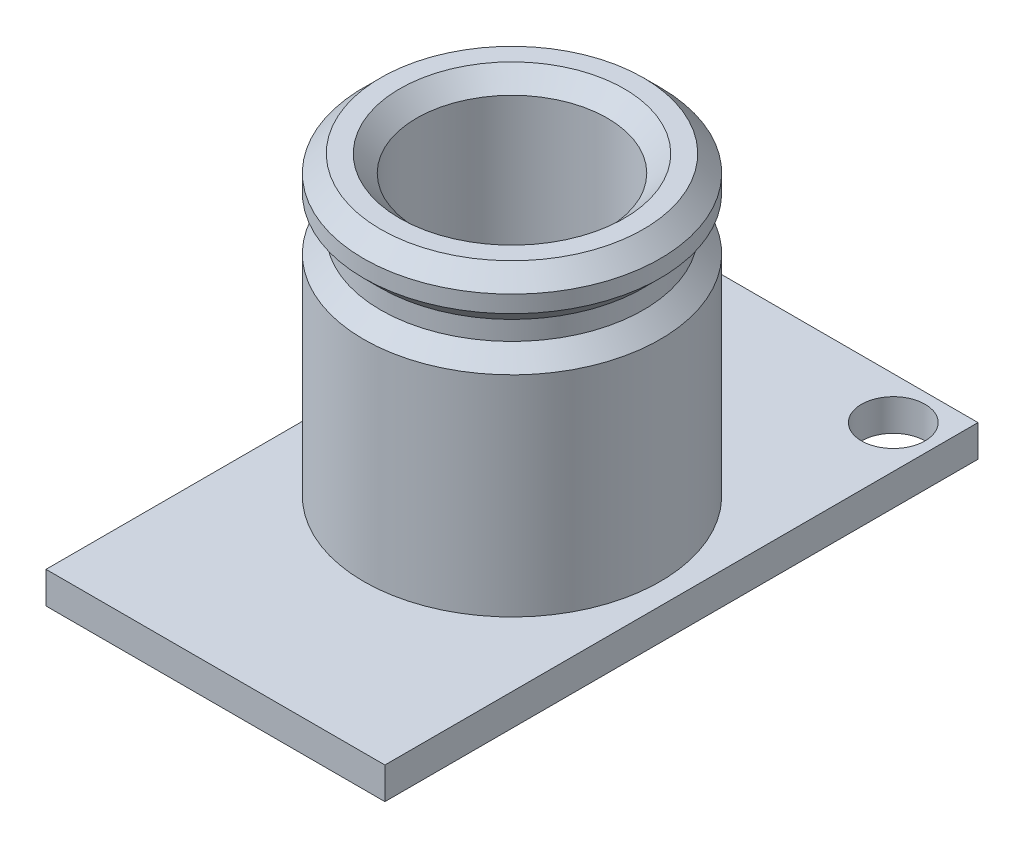
ISO-10303-21;
HEADER;
FILE_DESCRIPTION(('STEP AP214'),'2;1');
FILE_NAME('part.step','',(''),(''),'','','');
FILE_SCHEMA(('AUTOMOTIVE_DESIGN { 1 0 10303 214 1 1 1 1 }'));
ENDSEC;
DATA;
#1=APPLICATION_CONTEXT('core data for automotive mechanical design processes');
#2=APPLICATION_PROTOCOL_DEFINITION('international standard','automotive_design',2000,#1);
#3=PRODUCT_CONTEXT('',#1,'mechanical');
#4=PRODUCT('Part','Part','',(#3));
#5=PRODUCT_RELATED_PRODUCT_CATEGORY('part','',(#4));
#6=PRODUCT_DEFINITION_FORMATION('','',#4);
#7=PRODUCT_DEFINITION_CONTEXT('part definition',#1,'design');
#8=PRODUCT_DEFINITION('design','',#6,#7);
#9=PRODUCT_DEFINITION_SHAPE('','',#8);
#10=(LENGTH_UNIT() NAMED_UNIT(*) SI_UNIT(.MILLI.,.METRE.));
#11=(NAMED_UNIT(*) PLANE_ANGLE_UNIT() SI_UNIT($,.RADIAN.));
#12=(NAMED_UNIT(*) SI_UNIT($,.STERADIAN.) SOLID_ANGLE_UNIT());
#13=UNCERTAINTY_MEASURE_WITH_UNIT(LENGTH_MEASURE(1.E-05),#10,'distance_accuracy_value','');
#14=(GEOMETRIC_REPRESENTATION_CONTEXT(3) GLOBAL_UNCERTAINTY_ASSIGNED_CONTEXT((#13)) GLOBAL_UNIT_ASSIGNED_CONTEXT((#10,
#11,#12)) REPRESENTATION_CONTEXT('',''));
#15=CARTESIAN_POINT('',(0.,0.,0.));
#16=DIRECTION('',(0.,0.,1.));
#17=DIRECTION('',(1.,0.,0.));
#18=AXIS2_PLACEMENT_3D('',#15,#16,#17);
#19=CARTESIAN_POINT('',(0.,15.5,0.));
#20=DIRECTION('',(0.,-1.,0.));
#21=DIRECTION('',(0.,0.,-1.));
#22=AXIS2_PLACEMENT_3D('',#19,#20,#21);
#23=CYLINDRICAL_SURFACE('',#22,7.);
#24=CARTESIAN_POINT('',(0.,13.9,0.));
#25=DIRECTION('',(0.,-1.,0.));
#26=DIRECTION('',(0.,0.,-1.));
#27=AXIS2_PLACEMENT_3D('',#24,#25,#26);
#28=CIRCLE('',#27,7.00000000000005);
#29=CARTESIAN_POINT('',(0.,13.9,-7.));
#30=VERTEX_POINT('',#29);
#31=EDGE_CURVE('E74',#30,#30,#28,.T.);
#32=ORIENTED_EDGE('',*,*,#31,.F.);
#33=EDGE_LOOP('',(#32));
#34=FACE_BOUND('',#33,.T.);
#35=CARTESIAN_POINT('',(0.,14.7,0.));
#36=DIRECTION('',(0.,1.,0.));
#37=DIRECTION('',(0.,0.,1.));
#38=AXIS2_PLACEMENT_3D('',#35,#36,#37);
#39=CIRCLE('',#38,7.);
#40=CARTESIAN_POINT('',(0.,14.7,7.));
#41=VERTEX_POINT('',#40);
#42=EDGE_CURVE('E62',#41,#41,#39,.F.);
#43=ORIENTED_EDGE('',*,*,#42,.T.);
#44=EDGE_LOOP('',(#43));
#45=FACE_BOUND('',#44,.T.);
#46=ADVANCED_FACE('F50',(#34,#45),#23,.T.);
#47=CARTESIAN_POINT('',(0.,15.5,0.));
#48=DIRECTION('',(0.,1.,0.));
#49=DIRECTION('',(0.,0.,1.));
#50=AXIS2_PLACEMENT_3D('',#47,#48,#49);
#51=PLANE('',#50);
#52=CARTESIAN_POINT('',(0.,15.5,0.));
#53=DIRECTION('',(0.,1.,0.));
#54=DIRECTION('',(0.,0.,1.));
#55=AXIS2_PLACEMENT_3D('',#52,#53,#54);
#56=CIRCLE('',#55,5.3);
#57=CARTESIAN_POINT('',(0.,15.5,5.3));
#58=VERTEX_POINT('',#57);
#59=EDGE_CURVE('E11',#58,#58,#56,.F.);
#60=ORIENTED_EDGE('',*,*,#59,.T.);
#61=EDGE_LOOP('',(#60));
#62=FACE_BOUND('',#61,.T.);
#63=CARTESIAN_POINT('',(0.,15.5,0.));
#64=DIRECTION('',(0.,1.,0.));
#65=DIRECTION('',(0.,0.,1.));
#66=AXIS2_PLACEMENT_3D('',#63,#64,#65);
#67=CIRCLE('',#66,6.19999999999999);
#68=CARTESIAN_POINT('',(0.,15.5,6.19999999999999));
#69=VERTEX_POINT('',#68);
#70=EDGE_CURVE('E66',#69,#69,#67,.T.);
#71=ORIENTED_EDGE('',*,*,#70,.T.);
#72=EDGE_LOOP('',(#71));
#73=FACE_BOUND('',#72,.T.);
#74=ADVANCED_FACE('F108',(#62,#73),#51,.T.);
#75=CARTESIAN_POINT('',(0.,15.5,0.));
#76=DIRECTION('',(0.,-1.,0.));
#77=DIRECTION('',(0.,0.,-1.));
#78=AXIS2_PLACEMENT_3D('',#75,#76,#77);
#79=CONICAL_SURFACE('',#78,6.19999999999999,0.785398163397447);
#80=ORIENTED_EDGE('',*,*,#42,.F.);
#81=EDGE_LOOP('',(#80));
#82=FACE_BOUND('',#81,.T.);
#83=ORIENTED_EDGE('',*,*,#70,.F.);
#84=EDGE_LOOP('',(#83));
#85=FACE_BOUND('',#84,.T.);
#86=ADVANCED_FACE('F114',(#82,#85),#79,.T.);
#87=CARTESIAN_POINT('',(0.,13.9,0.));
#88=DIRECTION('',(0.,1.,0.));
#89=DIRECTION('',(0.,0.,1.));
#90=AXIS2_PLACEMENT_3D('',#87,#88,#89);
#91=CONICAL_SURFACE('',#90,7.00000000000005,0.785398163397366);
#92=CARTESIAN_POINT('',(0.,13.0999999999999,0.));
#93=DIRECTION('',(0.,-1.,0.));
#94=DIRECTION('',(0.,0.,-1.));
#95=AXIS2_PLACEMENT_3D('',#92,#93,#94);
#96=CIRCLE('',#95,6.20000000000004);
#97=CARTESIAN_POINT('',(0.,13.0999999999999,-6.2));
#98=VERTEX_POINT('',#97);
#99=EDGE_CURVE('E77',#98,#98,#96,.T.);
#100=ORIENTED_EDGE('',*,*,#99,.F.);
#101=EDGE_LOOP('',(#100));
#102=FACE_BOUND('',#101,.T.);
#103=ORIENTED_EDGE('',*,*,#31,.T.);
#104=EDGE_LOOP('',(#103));
#105=FACE_BOUND('',#104,.T.);
#106=ADVANCED_FACE('F122',(#102,#105),#91,.T.);
#107=CARTESIAN_POINT('',(0.,-1000.,-3.43024899888577E-12));
#108=DIRECTION('',(0.,-1.,0.));
#109=DIRECTION('',(0.,0.,-1.));
#110=AXIS2_PLACEMENT_3D('',#107,#108,#109);
#111=CYLINDRICAL_SURFACE('',#110,6.20000000000004);
#112=CARTESIAN_POINT('',(0.,12.2,0.));
#113=DIRECTION('',(0.,-1.,0.));
#114=DIRECTION('',(0.,0.,-1.));
#115=AXIS2_PLACEMENT_3D('',#112,#113,#114);
#116=CIRCLE('',#115,6.20000000000004);
#117=CARTESIAN_POINT('',(0.,12.2,-6.2));
#118=VERTEX_POINT('',#117);
#119=EDGE_CURVE('E80',#118,#118,#116,.T.);
#120=ORIENTED_EDGE('',*,*,#119,.F.);
#121=EDGE_LOOP('',(#120));
#122=FACE_BOUND('',#121,.T.);
#123=ORIENTED_EDGE('',*,*,#99,.T.);
#124=EDGE_LOOP('',(#123));
#125=FACE_BOUND('',#124,.T.);
#126=ADVANCED_FACE('F127',(#122,#125),#111,.T.);
#127=CARTESIAN_POINT('',(0.,12.2,0.));
#128=DIRECTION('',(0.,-1.,0.));
#129=DIRECTION('',(0.,0.,-1.));
#130=AXIS2_PLACEMENT_3D('',#127,#128,#129);
#131=CONICAL_SURFACE('',#130,6.20000000000004,0.785398163397503);
#132=CARTESIAN_POINT('',(0.,11.4000000000001,0.));
#133=DIRECTION('',(0.,-1.,0.));
#134=DIRECTION('',(0.,0.,-1.));
#135=AXIS2_PLACEMENT_3D('',#132,#133,#134);
#136=CIRCLE('',#135,7.00000000000004);
#137=CARTESIAN_POINT('',(0.,11.4000000000001,-7.));
#138=VERTEX_POINT('',#137);
#139=EDGE_CURVE('E83',#138,#138,#136,.T.);
#140=ORIENTED_EDGE('',*,*,#139,.F.);
#141=EDGE_LOOP('',(#140));
#142=FACE_BOUND('',#141,.T.);
#143=ORIENTED_EDGE('',*,*,#119,.T.);
#144=EDGE_LOOP('',(#143));
#145=FACE_BOUND('',#144,.T.);
#146=ADVANCED_FACE('F137',(#142,#145),#131,.T.);
#147=CARTESIAN_POINT('',(0.,1.5,0.));
#148=DIRECTION('',(0.,1.,0.));
#149=DIRECTION('',(0.,0.,1.));
#150=AXIS2_PLACEMENT_3D('',#147,#148,#149);
#151=PLANE('',#150);
#152=CARTESIAN_POINT('',(0.,1.5,0.));
#153=DIRECTION('',(0.,1.,0.));
#154=DIRECTION('',(0.,0.,1.));
#155=AXIS2_PLACEMENT_3D('',#152,#153,#154);
#156=CIRCLE('',#155,7.);
#157=CARTESIAN_POINT('',(0.,1.5,7.));
#158=VERTEX_POINT('',#157);
#159=EDGE_CURVE('E71',#158,#158,#156,.T.);
#160=ORIENTED_EDGE('',*,*,#159,.F.);
#161=EDGE_LOOP('',(#160));
#162=FACE_BOUND('',#161,.T.);
#163=ADVANCED_FACE('F103',(#162),#151,.F.);
#164=ORIENTED_EDGE('',*,*,#139,.T.);
#165=EDGE_LOOP('',(#164));
#166=FACE_BOUND('',#165,.T.);
#167=ORIENTED_EDGE('',*,*,#159,.T.);
#168=EDGE_LOOP('',(#167));
#169=FACE_BOUND('',#168,.T.);
#170=ADVANCED_FACE('F94',(#166,#169),#23,.T.);
#171=CARTESIAN_POINT('',(0.,7.5,0.));
#172=DIRECTION('',(0.,1.,0.));
#173=DIRECTION('',(0.,0.,1.));
#174=AXIS2_PLACEMENT_3D('',#171,#172,#173);
#175=CYLINDRICAL_SURFACE('',#174,4.5);
#176=CARTESIAN_POINT('',(0.,14.7,0.));
#177=DIRECTION('',(0.,1.,0.));
#178=DIRECTION('',(0.,0.,1.));
#179=AXIS2_PLACEMENT_3D('',#176,#177,#178);
#180=CIRCLE('',#179,4.5);
#181=CARTESIAN_POINT('',(0.,14.7,4.5));
#182=VERTEX_POINT('',#181);
#183=EDGE_CURVE('E58',#182,#182,#180,.T.);
#184=ORIENTED_EDGE('',*,*,#183,.T.);
#185=EDGE_LOOP('',(#184));
#186=FACE_BOUND('',#185,.T.);
#187=CARTESIAN_POINT('',(0.,7.5,0.));
#188=DIRECTION('',(0.,1.,0.));
#189=DIRECTION('',(0.,0.,1.));
#190=AXIS2_PLACEMENT_3D('',#187,#188,#189);
#191=CIRCLE('',#190,4.5);
#192=CARTESIAN_POINT('',(0.,7.5,4.5));
#193=VERTEX_POINT('',#192);
#194=EDGE_CURVE('E86',#193,#193,#191,.T.);
#195=ORIENTED_EDGE('',*,*,#194,.F.);
#196=EDGE_LOOP('',(#195));
#197=FACE_BOUND('',#196,.T.);
#198=ADVANCED_FACE('F92',(#186,#197),#175,.F.);
#199=CARTESIAN_POINT('',(0.,7.5,0.));
#200=DIRECTION('',(0.,1.,0.));
#201=DIRECTION('',(0.,0.,1.));
#202=AXIS2_PLACEMENT_3D('',#199,#200,#201);
#203=PLANE('',#202);
#204=ORIENTED_EDGE('',*,*,#194,.T.);
#205=EDGE_LOOP('',(#204));
#206=FACE_BOUND('',#205,.T.);
#207=ADVANCED_FACE('F90',(#206),#203,.T.);
#208=CARTESIAN_POINT('',(0.,14.7,0.));
#209=DIRECTION('',(0.,1.,0.));
#210=DIRECTION('',(0.,0.,1.));
#211=AXIS2_PLACEMENT_3D('',#208,#209,#210);
#212=CONICAL_SURFACE('',#211,4.5,0.785398163397449);
#213=ORIENTED_EDGE('',*,*,#59,.F.);
#214=EDGE_LOOP('',(#213));
#215=FACE_BOUND('',#214,.T.);
#216=ORIENTED_EDGE('',*,*,#183,.F.);
#217=EDGE_LOOP('',(#216));
#218=FACE_BOUND('',#217,.T.);
#219=ADVANCED_FACE('F53',(#215,#218),#212,.F.);
#220=CLOSED_SHELL('',(#46,#74,#86,#106,#126,#146,#163,#170,#198,#207,#219));
#221=MANIFOLD_SOLID_BREP('B2',#220);
#222=CARTESIAN_POINT('',(8.,1.5,-14.));
#223=DIRECTION('',(-1.,0.,0.));
#224=DIRECTION('',(0.,0.,1.));
#225=AXIS2_PLACEMENT_3D('',#222,#223,#224);
#226=PLANE('',#225);
#227=DIRECTION('',(0.,0.,-1.));
#228=VECTOR('',#227,1.);
#229=CARTESIAN_POINT('',(8.,0.,-14.));
#230=LINE('',#229,#228);
#231=CARTESIAN_POINT('',(8.,0.,14.));
#232=VERTEX_POINT('',#231);
#233=CARTESIAN_POINT('',(8.,0.,-14.));
#234=VERTEX_POINT('',#233);
#235=EDGE_CURVE('E278',#232,#234,#230,.T.);
#236=ORIENTED_EDGE('',*,*,#235,.T.);
#237=DIRECTION('',(0.,-1.,0.));
#238=VECTOR('',#237,1.);
#239=CARTESIAN_POINT('',(8.,1.5,-14.));
#240=LINE('',#239,#238);
#241=CARTESIAN_POINT('',(8.,1.5,-14.));
#242=VERTEX_POINT('',#241);
#243=EDGE_CURVE('E48',#242,#234,#240,.T.);
#244=ORIENTED_EDGE('',*,*,#243,.F.);
#245=DIRECTION('',(0.,0.,-1.));
#246=VECTOR('',#245,1.);
#247=CARTESIAN_POINT('',(8.,1.5,-14.));
#248=LINE('',#247,#246);
#249=CARTESIAN_POINT('',(8.,1.5,14.));
#250=VERTEX_POINT('',#249);
#251=EDGE_CURVE('E266',#250,#242,#248,.T.);
#252=ORIENTED_EDGE('',*,*,#251,.F.);
#253=DIRECTION('',(0.,-1.,0.));
#254=VECTOR('',#253,1.);
#255=CARTESIAN_POINT('',(8.,1.5,14.));
#256=LINE('',#255,#254);
#257=EDGE_CURVE('E274',#250,#232,#256,.T.);
#258=ORIENTED_EDGE('',*,*,#257,.T.);
#259=EDGE_LOOP('',(#236,#244,#252,#258));
#260=FACE_BOUND('',#259,.T.);
#261=ADVANCED_FACE('F215',(#260),#226,.F.);
#262=CARTESIAN_POINT('',(-8.,1.5,-14.));
#263=DIRECTION('',(0.,0.,1.));
#264=DIRECTION('',(1.,0.,0.));
#265=AXIS2_PLACEMENT_3D('',#262,#263,#264);
#266=PLANE('',#265);
#267=DIRECTION('',(-1.,0.,0.));
#268=VECTOR('',#267,1.);
#269=CARTESIAN_POINT('',(-8.,0.,-14.));
#270=LINE('',#269,#268);
#271=CARTESIAN_POINT('',(-8.,0.,-14.));
#272=VERTEX_POINT('',#271);
#273=EDGE_CURVE('E270',#234,#272,#270,.T.);
#274=ORIENTED_EDGE('',*,*,#273,.T.);
#275=DIRECTION('',(0.,-1.,0.));
#276=VECTOR('',#275,1.);
#277=CARTESIAN_POINT('',(-8.,1.5,-14.));
#278=LINE('',#277,#276);
#279=CARTESIAN_POINT('',(-8.,1.5,-14.));
#280=VERTEX_POINT('',#279);
#281=EDGE_CURVE('E223',#280,#272,#278,.T.);
#282=ORIENTED_EDGE('',*,*,#281,.F.);
#283=DIRECTION('',(-1.,0.,0.));
#284=VECTOR('',#283,1.);
#285=CARTESIAN_POINT('',(-8.,1.5,-14.));
#286=LINE('',#285,#284);
#287=EDGE_CURVE('E261',#242,#280,#286,.T.);
#288=ORIENTED_EDGE('',*,*,#287,.F.);
#289=ORIENTED_EDGE('',*,*,#243,.T.);
#290=EDGE_LOOP('',(#274,#282,#288,#289));
#291=FACE_BOUND('',#290,.T.);
#292=ADVANCED_FACE('F269',(#291),#266,.F.);
#293=CARTESIAN_POINT('',(-8.,1.5,-14.));
#294=DIRECTION('',(1.,0.,0.));
#295=DIRECTION('',(0.,0.,-1.));
#296=AXIS2_PLACEMENT_3D('',#293,#294,#295);
#297=PLANE('',#296);
#298=DIRECTION('',(0.,0.,1.));
#299=VECTOR('',#298,1.);
#300=CARTESIAN_POINT('',(-8.,0.,-14.));
#301=LINE('',#300,#299);
#302=CARTESIAN_POINT('',(-8.,0.,14.));
#303=VERTEX_POINT('',#302);
#304=EDGE_CURVE('E248',#272,#303,#301,.T.);
#305=ORIENTED_EDGE('',*,*,#304,.T.);
#306=DIRECTION('',(0.,-1.,0.));
#307=VECTOR('',#306,1.);
#308=CARTESIAN_POINT('',(-8.,1.5,14.));
#309=LINE('',#308,#307);
#310=CARTESIAN_POINT('',(-8.,1.5,14.));
#311=VERTEX_POINT('',#310);
#312=EDGE_CURVE('E271',#311,#303,#309,.T.);
#313=ORIENTED_EDGE('',*,*,#312,.F.);
#314=DIRECTION('',(0.,0.,1.));
#315=VECTOR('',#314,1.);
#316=CARTESIAN_POINT('',(-8.,1.5,-14.));
#317=LINE('',#316,#315);
#318=EDGE_CURVE('E264',#280,#311,#317,.T.);
#319=ORIENTED_EDGE('',*,*,#318,.F.);
#320=ORIENTED_EDGE('',*,*,#281,.T.);
#321=EDGE_LOOP('',(#305,#313,#319,#320));
#322=FACE_BOUND('',#321,.T.);
#323=ADVANCED_FACE('F272',(#322),#297,.F.);
#324=CARTESIAN_POINT('',(-8.,1.5,14.));
#325=DIRECTION('',(0.,0.,-1.));
#326=DIRECTION('',(-1.,0.,0.));
#327=AXIS2_PLACEMENT_3D('',#324,#325,#326);
#328=PLANE('',#327);
#329=DIRECTION('',(1.,0.,0.));
#330=VECTOR('',#329,1.);
#331=CARTESIAN_POINT('',(-8.,0.,14.));
#332=LINE('',#331,#330);
#333=EDGE_CURVE('E254',#303,#232,#332,.T.);
#334=ORIENTED_EDGE('',*,*,#333,.T.);
#335=ORIENTED_EDGE('',*,*,#257,.F.);
#336=DIRECTION('',(1.,0.,0.));
#337=VECTOR('',#336,1.);
#338=CARTESIAN_POINT('',(-8.,1.5,14.));
#339=LINE('',#338,#337);
#340=EDGE_CURVE('E231',#311,#250,#339,.T.);
#341=ORIENTED_EDGE('',*,*,#340,.F.);
#342=ORIENTED_EDGE('',*,*,#312,.T.);
#343=EDGE_LOOP('',(#334,#335,#341,#342));
#344=FACE_BOUND('',#343,.T.);
#345=ADVANCED_FACE('F286',(#344),#328,.F.);
#346=CARTESIAN_POINT('',(0.,1.5,0.));
#347=DIRECTION('',(0.,1.,0.));
#348=DIRECTION('',(0.,0.,1.));
#349=AXIS2_PLACEMENT_3D('',#346,#347,#348);
#350=PLANE('',#349);
#351=CARTESIAN_POINT('',(6.,1.5,-12.));
#352=DIRECTION('',(0.,-1.,0.));
#353=DIRECTION('',(0.,0.,1.));
#354=AXIS2_PLACEMENT_3D('',#351,#352,#353);
#355=CIRCLE('',#354,1.5);
#356=CARTESIAN_POINT('',(6.,1.5,-10.5));
#357=VERTEX_POINT('',#356);
#358=EDGE_CURVE('E298',#357,#357,#355,.T.);
#359=ORIENTED_EDGE('',*,*,#358,.T.);
#360=EDGE_LOOP('',(#359));
#361=FACE_BOUND('',#360,.T.);
#362=CARTESIAN_POINT('',(-6.,1.5,-12.));
#363=DIRECTION('',(0.,1.,0.));
#364=DIRECTION('',(0.,0.,1.));
#365=AXIS2_PLACEMENT_3D('',#362,#363,#364);
#366=CIRCLE('',#365,1.5);
#367=CARTESIAN_POINT('',(-6.,1.5,-10.5));
#368=VERTEX_POINT('',#367);
#369=EDGE_CURVE('E292',#368,#368,#366,.T.);
#370=ORIENTED_EDGE('',*,*,#369,.F.);
#371=EDGE_LOOP('',(#370));
#372=FACE_BOUND('',#371,.T.);
#373=ORIENTED_EDGE('',*,*,#251,.T.);
#374=ORIENTED_EDGE('',*,*,#287,.T.);
#375=ORIENTED_EDGE('',*,*,#318,.T.);
#376=ORIENTED_EDGE('',*,*,#340,.T.);
#377=EDGE_LOOP('',(#373,#374,#375,#376));
#378=FACE_BOUND('',#377,.T.);
#379=ADVANCED_FACE('F262',(#361,#372,#378),#350,.T.);
#380=CARTESIAN_POINT('',(0.,0.,0.));
#381=DIRECTION('',(0.,1.,0.));
#382=DIRECTION('',(0.,0.,1.));
#383=AXIS2_PLACEMENT_3D('',#380,#381,#382);
#384=PLANE('',#383);
#385=CARTESIAN_POINT('',(6.,0.,-12.));
#386=DIRECTION('',(0.,-1.,0.));
#387=DIRECTION('',(0.,0.,1.));
#388=AXIS2_PLACEMENT_3D('',#385,#386,#387);
#389=CIRCLE('',#388,1.5);
#390=CARTESIAN_POINT('',(6.,0.,-10.5));
#391=VERTEX_POINT('',#390);
#392=EDGE_CURVE('E295',#391,#391,#389,.T.);
#393=ORIENTED_EDGE('',*,*,#392,.F.);
#394=EDGE_LOOP('',(#393));
#395=FACE_BOUND('',#394,.T.);
#396=CARTESIAN_POINT('',(-6.,0.,-12.));
#397=DIRECTION('',(0.,1.,0.));
#398=DIRECTION('',(0.,0.,1.));
#399=AXIS2_PLACEMENT_3D('',#396,#397,#398);
#400=CIRCLE('',#399,1.5);
#401=CARTESIAN_POINT('',(-6.,0.,-10.5));
#402=VERTEX_POINT('',#401);
#403=EDGE_CURVE('E281',#402,#402,#400,.T.);
#404=ORIENTED_EDGE('',*,*,#403,.T.);
#405=EDGE_LOOP('',(#404));
#406=FACE_BOUND('',#405,.T.);
#407=ORIENTED_EDGE('',*,*,#235,.F.);
#408=ORIENTED_EDGE('',*,*,#333,.F.);
#409=ORIENTED_EDGE('',*,*,#304,.F.);
#410=ORIENTED_EDGE('',*,*,#273,.F.);
#411=EDGE_LOOP('',(#407,#408,#409,#410));
#412=FACE_BOUND('',#411,.T.);
#413=ADVANCED_FACE('F289',(#395,#406,#412),#384,.F.);
#414=CARTESIAN_POINT('',(-6.,0.,-12.));
#415=DIRECTION('',(0.,1.,0.));
#416=DIRECTION('',(0.,0.,1.));
#417=AXIS2_PLACEMENT_3D('',#414,#415,#416);
#418=CYLINDRICAL_SURFACE('',#417,1.5);
#419=ORIENTED_EDGE('',*,*,#403,.F.);
#420=EDGE_LOOP('',(#419));
#421=FACE_BOUND('',#420,.T.);
#422=ORIENTED_EDGE('',*,*,#369,.T.);
#423=EDGE_LOOP('',(#422));
#424=FACE_BOUND('',#423,.T.);
#425=ADVANCED_FACE('F309',(#421,#424),#418,.F.);
#426=CARTESIAN_POINT('',(6.,0.,-12.));
#427=DIRECTION('',(0.,1.,0.));
#428=DIRECTION('',(0.,0.,1.));
#429=AXIS2_PLACEMENT_3D('',#426,#427,#428);
#430=CYLINDRICAL_SURFACE('',#429,1.5);
#431=ORIENTED_EDGE('',*,*,#392,.T.);
#432=EDGE_LOOP('',(#431));
#433=FACE_BOUND('',#432,.T.);
#434=ORIENTED_EDGE('',*,*,#358,.F.);
#435=EDGE_LOOP('',(#434));
#436=FACE_BOUND('',#435,.T.);
#437=ADVANCED_FACE('F304',(#433,#436),#430,.F.);
#438=CLOSED_SHELL('',(#261,#292,#323,#345,#379,#413,#425,#437));
#439=MANIFOLD_SOLID_BREP('B6',#438);
#440=ADVANCED_BREP_SHAPE_REPRESENTATION('',(#18,#221,#439),#14);
#441=SHAPE_DEFINITION_REPRESENTATION(#9,#440);
ENDSEC;
END-ISO-10303-21;
